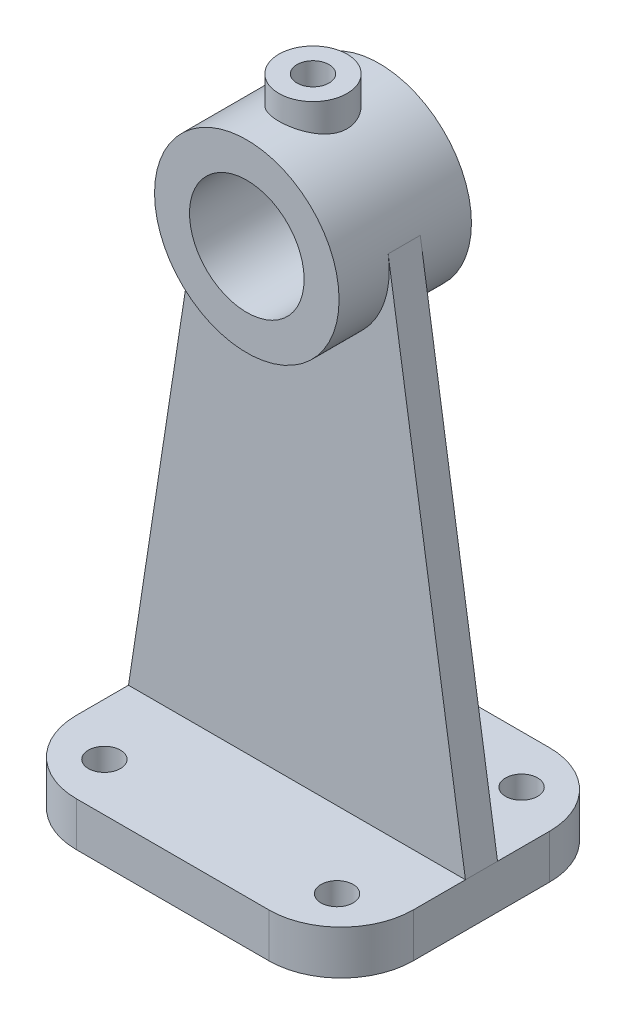
ISO-10303-21;
HEADER;
FILE_DESCRIPTION(('STEP AP214'),'2;1');
FILE_NAME('part.step','',(''),(''),'','','');
FILE_SCHEMA(('AUTOMOTIVE_DESIGN { 1 0 10303 214 1 1 1 1 }'));
ENDSEC;
DATA;
#1=APPLICATION_CONTEXT('core data for automotive mechanical design processes');
#2=APPLICATION_PROTOCOL_DEFINITION('international standard','automotive_design',2000,#1);
#3=PRODUCT_CONTEXT('',#1,'mechanical');
#4=PRODUCT('Part','Part','',(#3));
#5=PRODUCT_RELATED_PRODUCT_CATEGORY('part','',(#4));
#6=PRODUCT_DEFINITION_FORMATION('','',#4);
#7=PRODUCT_DEFINITION_CONTEXT('part definition',#1,'design');
#8=PRODUCT_DEFINITION('design','',#6,#7);
#9=PRODUCT_DEFINITION_SHAPE('','',#8);
#10=(LENGTH_UNIT() NAMED_UNIT(*) SI_UNIT(.MILLI.,.METRE.));
#11=(NAMED_UNIT(*) PLANE_ANGLE_UNIT() SI_UNIT($,.RADIAN.));
#12=(NAMED_UNIT(*) SI_UNIT($,.STERADIAN.) SOLID_ANGLE_UNIT());
#13=UNCERTAINTY_MEASURE_WITH_UNIT(LENGTH_MEASURE(1.E-05),#10,'distance_accuracy_value','');
#14=(GEOMETRIC_REPRESENTATION_CONTEXT(3) GLOBAL_UNCERTAINTY_ASSIGNED_CONTEXT((#13)) GLOBAL_UNIT_ASSIGNED_CONTEXT((#10,
#11,#12)) REPRESENTATION_CONTEXT('',''));
#15=CARTESIAN_POINT('',(0.,0.,0.));
#16=DIRECTION('',(0.,0.,1.));
#17=DIRECTION('',(1.,0.,0.));
#18=AXIS2_PLACEMENT_3D('',#15,#16,#17);
#19=CARTESIAN_POINT('',(0.,133.,-35.));
#20=DIRECTION('',(0.,0.,1.));
#21=DIRECTION('',(1.,0.,0.));
#22=AXIS2_PLACEMENT_3D('',#19,#20,#21);
#23=CYLINDRICAL_SURFACE('',#22,14.285);
#24=CARTESIAN_POINT('',(0.,133.,16.5));
#25=DIRECTION('',(0.,0.,1.));
#26=DIRECTION('',(1.,0.,0.));
#27=AXIS2_PLACEMENT_3D('',#24,#25,#26);
#28=CIRCLE('',#27,14.285);
#29=CARTESIAN_POINT('',(14.285,133.,16.5));
#30=VERTEX_POINT('',#29);
#31=EDGE_CURVE('E76',#30,#30,#28,.T.);
#32=ORIENTED_EDGE('',*,*,#31,.T.);
#33=EDGE_LOOP('',(#32));
#34=FACE_BOUND('',#33,.T.);
#35=CARTESIAN_POINT('',(0.,133.,-16.5));
#36=DIRECTION('',(0.,0.,1.));
#37=DIRECTION('',(1.,0.,0.));
#38=AXIS2_PLACEMENT_3D('',#35,#36,#37);
#39=CIRCLE('',#38,14.285);
#40=CARTESIAN_POINT('',(14.285,133.,-16.5));
#41=VERTEX_POINT('',#40);
#42=EDGE_CURVE('E80',#41,#41,#39,.T.);
#43=ORIENTED_EDGE('',*,*,#42,.F.);
#44=EDGE_LOOP('',(#43));
#45=FACE_BOUND('',#44,.T.);
#46=CARTESIAN_POINT('',(0.,147.285,4.));
#47=CARTESIAN_POINT('',(0.22009302424236,147.284997144267,3.99999568497697));
#48=CARTESIAN_POINT('',(0.44023091522861,147.279863933326,3.981773975814));
#49=CARTESIAN_POINT('',(0.874138155971838,147.259886135789,3.90951451057177));
#50=CARTESIAN_POINT('',(1.08790485893037,147.245037570332,3.85546208013016));
#51=CARTESIAN_POINT('',(1.50274577014489,147.207263379017,3.71345656078877));
#52=CARTESIAN_POINT('',(1.70383683851087,147.184348761203,3.62554965904913));
#53=CARTESIAN_POINT('',(2.08842353368351,147.132848509751,3.41850892059835));
#54=CARTESIAN_POINT('',(2.27191751756241,147.10426234736,3.29937217202442));
#55=CARTESIAN_POINT('',(2.62075210104795,147.043680766921,3.03006766107764));
#56=CARTESIAN_POINT('',(2.78558329002922,147.011622468074,2.87925420207317));
#57=CARTESIAN_POINT('',(3.08797591399402,146.94810217824,2.55225592676252));
#58=CARTESIAN_POINT('',(3.22553344326223,146.916640273241,2.37606748286802));
#59=CARTESIAN_POINT('',(3.47203324917597,146.857223487263,1.99916029211444));
#60=CARTESIAN_POINT('',(3.58037571791847,146.829347495564,1.79803567820712));
#61=CARTESIAN_POINT('',(3.76150125753448,146.78118930719,1.37951723065095));
#62=CARTESIAN_POINT('',(3.8342916400818,146.76090554929,1.16212675286877));
#63=CARTESIAN_POINT('',(3.94045126393201,146.730880008796,0.722920959308169));
#64=CARTESIAN_POINT('',(3.97475029240734,146.720890082871,0.501347773789032));
#65=CARTESIAN_POINT('',(4.00585428325889,146.711843113028,0.0553843124265916));
#66=CARTESIAN_POINT('',(4.00266703857357,146.71278379677,-0.169005368212922));
#67=CARTESIAN_POINT('',(3.9596240483907,146.725270500353,-0.606860128109716));
#68=CARTESIAN_POINT('',(3.92090839695286,146.736486761805,-0.820448206584452));
#69=CARTESIAN_POINT('',(3.80973978539547,146.767730710783,-1.23796834088705));
#70=CARTESIAN_POINT('',(3.73728388334307,146.787759166668,-1.44189955298969));
#71=CARTESIAN_POINT('',(3.55979761985351,146.834650244186,-1.83721751201345));
#72=CARTESIAN_POINT('',(3.45437928032734,146.861593540496,-2.02842009280114));
#73=CARTESIAN_POINT('',(3.21423078802663,146.919236896169,-2.39081510860438));
#74=CARTESIAN_POINT('',(3.07949433805684,146.949937761994,-2.56200323258076));
#75=CARTESIAN_POINT('',(2.77876950597874,147.012996110559,-2.88600607984723));
#76=CARTESIAN_POINT('',(2.61182794590744,147.045373372559,-3.03793361073108));
#77=CARTESIAN_POINT('',(2.25443645568894,147.107146421854,-3.31182786304264));
#78=CARTESIAN_POINT('',(2.06398540169295,147.136542066493,-3.43379315132012));
#79=CARTESIAN_POINT('',(1.6635152958382,147.189252522125,-3.64474764123881));
#80=CARTESIAN_POINT('',(1.45339976430188,147.21253496299,-3.73356231092955));
#81=CARTESIAN_POINT('',(1.02041583783739,147.250162316295,-3.87434386494985));
#82=CARTESIAN_POINT('',(0.797550539945529,147.264509389238,-3.92631965705661));
#83=CARTESIAN_POINT('',(0.352953421392332,147.282316899524,-3.9905226553432));
#84=CARTESIAN_POINT('',(0.131408509517547,147.286107168571,-4.00395452898717));
#85=CARTESIAN_POINT('',(-0.310773436458212,147.283329791694,-3.99403448235909));
#86=CARTESIAN_POINT('',(-0.531410571913228,147.276763335407,-3.97068678681072));
#87=CARTESIAN_POINT('',(-0.961118512194685,147.254224598873,-3.88885354567434));
#88=CARTESIAN_POINT('',(-1.17033014666336,147.238435618185,-3.83105232481679));
#89=CARTESIAN_POINT('',(-1.57605774326172,147.199255103343,-3.68275852997678));
#90=CARTESIAN_POINT('',(-1.77257226009566,147.175862705524,-3.59226224206014));
#91=CARTESIAN_POINT('',(-2.15191254185645,147.123312837239,-3.3789958757998));
#92=CARTESIAN_POINT('',(-2.33436331755546,147.094044428399,-3.25558683800589));
#93=CARTESIAN_POINT('',(-2.67638476686657,147.03311866464,-2.98079060753633));
#94=CARTESIAN_POINT('',(-2.83595043038472,147.001460788918,-2.82939730499466));
#95=CARTESIAN_POINT('',(-3.13283930298123,146.938089557771,-2.49728980038699));
#96=CARTESIAN_POINT('',(-3.26930925526994,146.906405525158,-2.31580571531386));
#97=CARTESIAN_POINT('',(-3.50989201018543,146.847645174096,-1.93183247587161));
#98=CARTESIAN_POINT('',(-3.61400602166742,146.820568683521,-1.72934410662381));
#99=CARTESIAN_POINT('',(-3.7861508530391,146.774405096014,-1.31001108760472));
#100=CARTESIAN_POINT('',(-3.85437964141863,146.755274290824,-1.0932527868899));
#101=CARTESIAN_POINT('',(-3.95322025246297,146.727198011851,-0.650703610337138));
#102=CARTESIAN_POINT('',(-3.98384291548367,146.718249602941,-0.424915356864122));
#103=CARTESIAN_POINT('',(-4.00593277353849,146.711813934234,0.0205009088167304));
#104=CARTESIAN_POINT('',(-3.99877852058209,146.713923140323,0.240055693915191));
#105=CARTESIAN_POINT('',(-3.94875140179654,146.728410363477,0.674694617937238));
#106=CARTESIAN_POINT('',(-3.90587964110076,146.740788062827,0.889778894971523));
#107=CARTESIAN_POINT('',(-3.78647041427012,146.774165178418,1.30743627144398));
#108=CARTESIAN_POINT('',(-3.71025329935655,146.795082429745,1.51010799700324));
#109=CARTESIAN_POINT('',(-3.52656461252407,146.843176678526,1.89994574406938));
#110=CARTESIAN_POINT('',(-3.41908769444223,146.870354746563,2.08710910623969));
#111=CARTESIAN_POINT('',(-3.17187183467299,146.929000745799,2.44712735039979));
#112=CARTESIAN_POINT('',(-3.0312058148959,146.960578598939,2.61932777652731));
#113=CARTESIAN_POINT('',(-2.72333111462037,147.023885031898,2.93812710254197));
#114=CARTESIAN_POINT('',(-2.55611583482905,147.055613647285,3.08471961804781));
#115=CARTESIAN_POINT('',(-2.1949851045199,147.116570452885,3.35166667884126));
#116=CARTESIAN_POINT('',(-2.00051922225587,147.145719069711,3.4712964394295));
#117=CARTESIAN_POINT('',(-1.59342113725689,147.197331098927,3.67598225645541));
#118=CARTESIAN_POINT('',(-1.38079948501504,147.219798360343,3.76105822917535));
#119=CARTESIAN_POINT('',(-0.974462444777233,147.252970806822,3.88444856822068));
#120=CARTESIAN_POINT('',(-0.782323841387655,147.264889806309,3.92767345910347));
#121=CARTESIAN_POINT('',(-0.393468401857418,147.280905201103,3.98544935071547));
#122=CARTESIAN_POINT('',(-0.196752128476115,147.285002552882,4.00000385741424));
#123=CARTESIAN_POINT('',(0.,147.285,4.));
#124=B_SPLINE_CURVE_WITH_KNOTS('',3,(#46,#47,#48,#49,#50,#51,#52,#53,#54,#55,#56,#57,#58,#59,
#60,#61,#62,#63,#64,#65,#66,#67,#68,#69,#70,#71,#72,#73,#74,#75,#76,#77,#78,#79,#80,#81,#82,#83,
#84,#85,#86,#87,#88,#89,#90,#91,#92,#93,#94,#95,#96,#97,#98,#99,#100,#101,#102,#103,#104,#105,
#106,#107,#108,#109,#110,#111,#112,#113,#114,#115,#116,#117,#118,#119,#120,#121,#122,#123),
.UNSPECIFIED.,.T.,.F.,(4,2,2,2,2,2,2,2,2,2,2,2,2,2,2,2,2,2,2,2,2,2,2,2,2,2,2,2,2,2,2,2,2,2,2,2,
2,2,4),(0.,0.65955708279654,1.31938445220335,1.97831479961346,2.6373066073844,3.31132655793415,
3.98544296168061,4.67249615256788,5.35940798392157,6.02934362721507,6.69914000153079,
7.34816709980077,7.99725079965864,8.65428185238697,9.3114541674288,9.9923679039777,
10.6733142035687,11.3577966188,12.0421134671274,12.7047962735527,13.3674029657744,
14.0172679140362,14.6672067056968,15.3308197515444,15.9945778569911,16.6791268921084,
17.3636503486099,18.0443567905301,18.7248669656606,19.3807195837233,20.0365519098412,
20.6862174060534,21.3359940757725,22.0066852800215,22.6775434583037,23.3647163707373,
24.0514926430534,24.6411757197952,25.2307866824254),.UNSPECIFIED.);
#125=CARTESIAN_POINT('',(0.,147.285,4.));
#126=VERTEX_POINT('',#125);
#127=EDGE_CURVE('E95',#126,#126,#124,.T.);
#128=ORIENTED_EDGE('',*,*,#127,.T.);
#129=EDGE_LOOP('',(#128));
#130=FACE_BOUND('',#129,.T.);
#131=ADVANCED_FACE('F54',(#34,#45,#130),#23,.F.);
#132=CARTESIAN_POINT('',(0.,133.,16.5));
#133=DIRECTION('',(0.,0.,-1.));
#134=DIRECTION('',(-1.,0.,0.));
#135=AXIS2_PLACEMENT_3D('',#132,#133,#134);
#136=CYLINDRICAL_SURFACE('',#135,23.);
#137=CARTESIAN_POINT('',(0.,133.,-16.5));
#138=DIRECTION('',(0.,0.,1.));
#139=DIRECTION('',(1.,0.,0.));
#140=AXIS2_PLACEMENT_3D('',#137,#138,#139);
#141=CIRCLE('',#140,23.);
#142=CARTESIAN_POINT('',(23.,133.,-16.5));
#143=VERTEX_POINT('',#142);
#144=EDGE_CURVE('E72',#143,#143,#141,.T.);
#145=ORIENTED_EDGE('',*,*,#144,.T.);
#146=EDGE_LOOP('',(#145));
#147=FACE_BOUND('',#146,.T.);
#148=CARTESIAN_POINT('',(0.,133.,16.5));
#149=DIRECTION('',(0.,0.,1.));
#150=DIRECTION('',(1.,0.,0.));
#151=AXIS2_PLACEMENT_3D('',#148,#149,#150);
#152=CIRCLE('',#151,23.);
#153=CARTESIAN_POINT('',(23.,133.,16.5));
#154=VERTEX_POINT('',#153);
#155=EDGE_CURVE('E70',#154,#154,#152,.T.);
#156=ORIENTED_EDGE('',*,*,#155,.F.);
#157=EDGE_LOOP('',(#156));
#158=FACE_BOUND('',#157,.T.);
#159=CARTESIAN_POINT('',(0.,156.,8.5));
#160=CARTESIAN_POINT('',(0.2303843535196,156.000000671532,8.50000092390018));
#161=CARTESIAN_POINT('',(0.460755764064527,155.996530952038,8.490626307051));
#162=CARTESIAN_POINT('',(0.919774466012311,155.982748471244,8.45322615583438));
#163=CARTESIAN_POINT('',(1.1484217809832,155.972435803656,8.42520087688676));
#164=CARTESIAN_POINT('',(1.6022698846208,155.945248103202,8.3507847979437));
#165=CARTESIAN_POINT('',(1.82747118348694,155.928374051743,8.30439674451403));
#166=CARTESIAN_POINT('',(2.27287192076185,155.888513516355,8.19369970409339));
#167=CARTESIAN_POINT('',(2.49307123986755,155.8655268868,8.12939029014135));
#168=CARTESIAN_POINT('',(2.92651312025245,155.814097734591,7.98358912358547));
#169=CARTESIAN_POINT('',(3.13976948976368,155.785666927461,7.90213423027139));
#170=CARTESIAN_POINT('',(3.55853700696215,155.724031929884,7.72261185035818));
#171=CARTESIAN_POINT('',(3.76404543129722,155.690826080425,7.62453858785046));
#172=CARTESIAN_POINT('',(4.16598405348069,155.620481916584,7.41256992322697));
#173=CARTESIAN_POINT('',(4.36241554655435,155.583344165766,7.29867678786405));
#174=CARTESIAN_POINT('',(4.74519086766156,155.506028256287,7.05581747048807));
#175=CARTESIAN_POINT('',(4.93153102121554,155.465849002747,6.92684585134791));
#176=CARTESIAN_POINT('',(5.29976389951742,155.381900682746,6.64962920289078));
#177=CARTESIAN_POINT('',(5.48123379841326,155.338053692788,6.50084593447948));
#178=CARTESIAN_POINT('',(5.83111960895947,155.249283751714,6.18893973695454));
#179=CARTESIAN_POINT('',(5.99953515207784,155.204360770269,6.02581640328981));
#180=CARTESIAN_POINT('',(6.32240937926896,155.114593222223,5.68612976194519));
#181=CARTESIAN_POINT('',(6.47686174274878,155.069748700055,5.50956043374837));
#182=CARTESIAN_POINT('',(6.77074060541012,154.981369696935,5.14412587806603));
#183=CARTESIAN_POINT('',(6.91017217460418,154.937834777547,4.95526483418476));
#184=CARTESIAN_POINT('',(7.17807302258331,154.851677371526,4.55900988476143));
#185=CARTESIAN_POINT('',(7.30594013632557,154.80914934851,4.35118761358472));
#186=CARTESIAN_POINT('',(7.54357291586669,154.728098636574,3.92479946494549));
#187=CARTESIAN_POINT('',(7.65334582675269,154.689574346817,3.70623793331072));
#188=CARTESIAN_POINT('',(7.85390827332818,154.61775840728,3.25975591370399));
#189=CARTESIAN_POINT('',(7.94469944390327,154.584466306918,3.03183623376825));
#190=CARTESIAN_POINT('',(8.10644014119538,154.524244158858,2.56824573177397));
#191=CARTESIAN_POINT('',(8.17739079401269,154.497313750099,2.33257535047556));
#192=CARTESIAN_POINT('',(8.29627782145823,154.45170543472,1.86484521566822));
#193=CARTESIAN_POINT('',(8.3450220077663,154.432740248809,1.63301877979533));
#194=CARTESIAN_POINT('',(8.4230304572334,154.402203623392,1.16562670174953));
#195=CARTESIAN_POINT('',(8.45229520778471,154.390631998893,0.930061153283447));
#196=CARTESIAN_POINT('',(8.49101286020158,154.375292657449,0.457134477937399));
#197=CARTESIAN_POINT('',(8.50047255224042,154.371522265853,0.219773994472154));
#198=CARTESIAN_POINT('',(8.49949116932001,154.371912709309,-0.25489472946103));
#199=CARTESIAN_POINT('',(8.48905083552335,154.376073248979,-0.492202971545446));
#200=CARTESIAN_POINT('',(8.44957598170591,154.391705799528,-0.951095500484753));
#201=CARTESIAN_POINT('',(8.42165766641654,154.4027387177,-1.17279190588333));
#202=CARTESIAN_POINT('',(8.34854088015422,154.431364993254,-1.61296485191828));
#203=CARTESIAN_POINT('',(8.30333637168613,154.448960642728,-1.83144023984012));
#204=CARTESIAN_POINT('',(8.1960856748943,154.490171534489,-2.26356551477596));
#205=CARTESIAN_POINT('',(8.13404403696607,154.513785150259,-2.47721668870552));
#206=CARTESIAN_POINT('',(7.99362727798094,154.566352012482,-2.89848958737727));
#207=CARTESIAN_POINT('',(7.91524591441696,154.595307299206,-3.10610897306538));
#208=CARTESIAN_POINT('',(7.74121894386533,154.658306546694,-3.51772106627672));
#209=CARTESIAN_POINT('',(7.64528542399561,154.692433436857,-3.72157925493569));
#210=CARTESIAN_POINT('',(7.4378293999481,154.764437679341,-4.12059182303324));
#211=CARTESIAN_POINT('',(7.32630159366143,154.802316305982,-4.31574321223744));
#212=CARTESIAN_POINT('',(7.08842127844987,154.880812754645,-4.69623573364903));
#213=CARTESIAN_POINT('',(6.96206718796178,154.9214308687,-4.88157581618987));
#214=CARTESIAN_POINT('',(6.69531756477428,155.004368403694,-5.24145938656223));
#215=CARTESIAN_POINT('',(6.55492141643844,155.046687899177,-5.41600240048174));
#216=CARTESIAN_POINT('',(6.25126853954555,155.134774253076,-5.76441405806297));
#217=CARTESIAN_POINT('',(6.08711740351488,155.180585644113,-5.93749297684727));
#218=CARTESIAN_POINT('',(5.7448379094331,155.271690264777,-6.26926062418038));
#219=CARTESIAN_POINT('',(5.5667138298831,155.316983648188,-6.42795372581741));
#220=CARTESIAN_POINT('',(5.19739902015437,155.405872639778,-6.73008087531602));
#221=CARTESIAN_POINT('',(5.006201488829,155.449467345462,-6.87350688011115));
#222=CARTESIAN_POINT('',(4.61204371215187,155.533744625961,-7.14395934113844));
#223=CARTESIAN_POINT('',(4.40908819828196,155.57442835764,-7.27099232850813));
#224=CARTESIAN_POINT('',(3.9894395609409,155.65238604974,-7.50956058640278));
#225=CARTESIAN_POINT('',(3.77258502758275,155.689599095028,-7.62083224605213));
#226=CARTESIAN_POINT('',(3.32951775467291,155.758834718336,-7.82455982031676));
#227=CARTESIAN_POINT('',(3.10330900114456,155.790859479154,-7.91702365191118));
#228=CARTESIAN_POINT('',(2.6430939746829,155.848803676122,-8.08231548600394));
#229=CARTESIAN_POINT('',(2.40908871632731,155.874723903155,-8.15514603230132));
#230=CARTESIAN_POINT('',(1.9350439952277,155.91969181521,-8.28044069240963));
#231=CARTESIAN_POINT('',(1.69500488285415,155.938739898297,-8.33290598588326));
#232=CARTESIAN_POINT('',(1.22339222806117,155.968591929582,-8.41472429982503));
#233=CARTESIAN_POINT('',(0.992025587660164,155.979772323411,-8.44513519679533));
#234=CARTESIAN_POINT('',(0.527345872452439,155.995128550509,-8.48683191770743));
#235=CARTESIAN_POINT('',(0.294032865288788,155.999304626191,-8.49811840352997));
#236=CARTESIAN_POINT('',(-0.17270385757152,156.000535365626,-8.50144862839866));
#237=CARTESIAN_POINT('',(-0.406127544111998,155.997591371527,-8.49349599405788));
#238=CARTESIAN_POINT('',(-0.871332852209467,155.984667108629,-8.45843884937208));
#239=CARTESIAN_POINT('',(-1.103114497456,155.974686941549,-8.43133461589561));
#240=CARTESIAN_POINT('',(-1.55467985982106,155.948468462395,-8.35962141314091));
#241=CARTESIAN_POINT('',(-1.77458834535143,155.9324778325,-8.31570410669215));
#242=CARTESIAN_POINT('',(-2.20985039311505,155.894634753244,-8.21076702133866));
#243=CARTESIAN_POINT('',(-2.42520232028864,155.87278023694,-8.14974121157023));
#244=CARTESIAN_POINT('',(-2.84981731667042,155.823764138454,-8.01114267003831));
#245=CARTESIAN_POINT('',(-3.05908208932274,155.796604057734,-7.93357461911824));
#246=CARTESIAN_POINT('',(-3.47038743547252,155.73762513017,-7.76247672300289));
#247=CARTESIAN_POINT('',(-3.67242523255576,155.705804516289,-7.66894082137123));
#248=CARTESIAN_POINT('',(-4.07370949866064,155.637303338465,-7.46372045551934));
#249=CARTESIAN_POINT('',(-4.27270977395785,155.600509574712,-7.35159246885837));
#250=CARTESIAN_POINT('',(-4.66066924727655,155.523704981047,-7.11197345631616));
#251=CARTESIAN_POINT('',(-4.84962496162319,155.483693046938,-6.98447714981418));
#252=CARTESIAN_POINT('',(-5.21640979180752,155.401437501487,-6.71497336271192));
#253=CARTESIAN_POINT('',(-5.39423733684981,155.359193576634,-6.57296384091647));
#254=CARTESIAN_POINT('',(-5.73778277441456,155.27350887622,-6.27530951555939));
#255=CARTESIAN_POINT('',(-5.9035002417258,155.230068058707,-6.11966423363803));
#256=CARTESIAN_POINT('',(-6.23093771015443,155.140592325504,-5.78645101222071));
#257=CARTESIAN_POINT('',(-6.39190143704776,155.09454966052,-5.60814103376892));
#258=CARTESIAN_POINT('',(-6.69824407978276,155.003614590936,-5.23842940821814));
#259=CARTESIAN_POINT('',(-6.84362800009919,154.95872182052,-5.04703199755984));
#260=CARTESIAN_POINT('',(-7.11796698893779,154.871334823052,-4.65213628498448));
#261=CARTESIAN_POINT('',(-7.24691401704295,154.828841775487,-4.44863213167027));
#262=CARTESIAN_POINT('',(-7.48729606917449,154.747562999759,-4.0309346702154));
#263=CARTESIAN_POINT('',(-7.59873845246631,154.708775716328,-3.81674590424817));
#264=CARTESIAN_POINT('',(-7.80363897624821,154.635967560877,-3.37816690182543));
#265=CARTESIAN_POINT('',(-7.89703007704826,154.601964579501,-3.15374232374013));
#266=CARTESIAN_POINT('',(-8.06442477725969,154.540033043942,-2.69706607766691));
#267=CARTESIAN_POINT('',(-8.13843694545878,154.512101805945,-2.46481792047954));
#268=CARTESIAN_POINT('',(-8.26635750384298,154.463271596412,-1.99418634976084));
#269=CARTESIAN_POINT('',(-8.32027137103585,154.442370709182,-1.75580462665109));
#270=CARTESIAN_POINT('',(-8.4074229052977,154.408349753906,-1.27474717112078));
#271=CARTESIAN_POINT('',(-8.44066195659651,154.395229164953,-1.03207172729447));
#272=CARTESIAN_POINT('',(-8.48465708275753,154.377818176352,-0.559722558904993));
#273=CARTESIAN_POINT('',(-8.49668974979592,154.373026653293,-0.330185357621207));
#274=CARTESIAN_POINT('',(-8.5021213985931,154.370866706402,0.129139238760008));
#275=CARTESIAN_POINT('',(-8.49552119285347,154.373497958894,0.358926622511256));
#276=CARTESIAN_POINT('',(-8.46376017847601,154.386094828791,0.816988071640291));
#277=CARTESIAN_POINT('',(-8.43860098219924,154.396059809058,1.04526226674214));
#278=CARTESIAN_POINT('',(-8.36998778541738,154.422993702746,1.49862130786705));
#279=CARTESIAN_POINT('',(-8.32653378534828,154.439962616001,1.7237061539661));
#280=CARTESIAN_POINT('',(-8.22328875520353,154.479769176185,2.16260543681577));
#281=CARTESIAN_POINT('',(-8.16400899290389,154.50242201407,2.37655732870775));
#282=CARTESIAN_POINT('',(-8.02911081461072,154.553156845182,2.79865966294023));
#283=CARTESIAN_POINT('',(-7.95348663757543,154.58124075237,3.00680803038589));
#284=CARTESIAN_POINT('',(-7.78652523737916,154.642040315485,3.41596599524497));
#285=CARTESIAN_POINT('',(-7.69519078284641,154.67475515512,3.61697684298877));
#286=CARTESIAN_POINT('',(-7.49746547993031,154.743941228821,4.01081416927355));
#287=CARTESIAN_POINT('',(-7.39106879451869,154.780413917659,4.20363743706633));
#288=CARTESIAN_POINT('',(-7.03874622358876,154.897931554853,4.78740158759602));
#289=CARTESIAN_POINT('',(-6.76813416106256,154.983852927251,5.16282190515085));
#290=CARTESIAN_POINT('',(-6.17010891150782,155.159117815245,5.8645017163819));
#291=CARTESIAN_POINT('',(-5.84267793904373,155.248462395528,6.1907457569867));
#292=CARTESIAN_POINT('',(-5.30564342666222,155.380497784868,6.64523375386263));
#293=CARTESIAN_POINT('',(-5.11365023571532,155.425249699654,6.79409136664982));
#294=CARTESIAN_POINT('',(-4.71723419092127,155.511969967823,7.07507268299527));
#295=CARTESIAN_POINT('',(-4.51281602105976,155.553939357844,7.20720263536728));
#296=CARTESIAN_POINT('',(-4.09272091384426,155.633943244485,7.45379099028934));
#297=CARTESIAN_POINT('',(-3.87703855030989,155.671975817862,7.56824076890878));
#298=CARTESIAN_POINT('',(-3.43602996644205,155.742988994294,7.77838846643826));
#299=CARTESIAN_POINT('',(-3.21070791624702,155.775971754187,7.87409439598308));
#300=CARTESIAN_POINT('',(-2.74469738963315,155.836890465011,8.0486317157481));
#301=CARTESIAN_POINT('',(-2.50374843283787,155.864634630443,8.12683632414537));
#302=CARTESIAN_POINT('',(-2.01513607400942,155.912867298053,8.26156453785463));
#303=CARTESIAN_POINT('',(-1.76747241618916,155.933355523407,8.3180873159818));
#304=CARTESIAN_POINT('',(-1.26765894148453,155.966404582231,8.4087766357977));
#305=CARTESIAN_POINT('',(-1.01551091297882,155.978968506138,8.44295189309979));
#306=CARTESIAN_POINT('',(-0.508903177123802,155.99576544291,8.48856196964795));
#307=CARTESIAN_POINT('',(-0.254443694845288,155.999999258339,8.49999897961571));
#308=CARTESIAN_POINT('',(0.,156.,8.5));
#309=B_SPLINE_CURVE_WITH_KNOTS('',3,(#159,#160,#161,#162,#163,#164,#165,#166,#167,#168,#169,
#170,#171,#172,#173,#174,#175,#176,#177,#178,#179,#180,#181,#182,#183,#184,#185,#186,#187,#188,
#189,#190,#191,#192,#193,#194,#195,#196,#197,#198,#199,#200,#201,#202,#203,#204,#205,#206,#207,
#208,#209,#210,#211,#212,#213,#214,#215,#216,#217,#218,#219,#220,#221,#222,#223,#224,#225,#226,
#227,#228,#229,#230,#231,#232,#233,#234,#235,#236,#237,#238,#239,#240,#241,#242,#243,#244,#245,
#246,#247,#248,#249,#250,#251,#252,#253,#254,#255,#256,#257,#258,#259,#260,#261,#262,#263,#264,
#265,#266,#267,#268,#269,#270,#271,#272,#273,#274,#275,#276,#277,#278,#279,#280,#281,#282,#283,
#284,#285,#286,#287,#288,#289,#290,#291,#292,#293,#294,#295,#296,#297,#298,#299,#300,#301,#302,
#303,#304,#305,#306,#307,#308),.UNSPECIFIED.,.T.,.F.,(4,2,2,2,2,2,2,2,2,2,2,2,2,2,2,2,2,2,2,2,2,
2,2,2,2,2,2,2,2,2,2,2,2,2,2,2,2,2,2,2,2,2,2,2,2,2,2,2,2,2,2,2,2,2,2,2,2,2,2,2,2,2,2,2,2,2,2,2,2,
2,2,2,2,2,4),(0.,0.69091503010114,1.38182059835294,2.07262286516762,2.76344159116241,
3.4527900944173,4.14237868209481,4.83186856369923,5.52160783868734,6.23698719904983,
6.95238674763541,7.66810852530132,8.38358796135488,9.1257307245763,9.86757560125284,
10.6093565569405,11.3510954023675,12.0631321065893,12.775150994369,13.4869257261475,
14.1986739488904,14.8690466022238,15.5396536087054,16.2100795573969,16.8807621097826,
17.5636355748394,18.2467417862765,18.9299209330141,19.6131300450521,20.3409940702333,
21.0686360876711,21.7966595663707,22.5243920920089,23.2631371078579,24.0015705094263,
24.7399081893688,25.4782030945197,26.178194260432,26.8781611997089,27.5779962040826,
28.2778210913718,28.9515057298538,29.6254281459989,30.2991601194086,30.9731482022817,
31.6664640970346,32.3600189008491,33.0536713835048,33.7473482101203,34.4802606726343,
35.2129370021746,35.9459703699519,36.6786947277413,37.4140901191451,38.1491597893407,
38.8840289982918,39.6188490006421,40.3076927836302,40.9965065294877,41.6852604398881,
42.374014333875,43.0427597039458,43.7117411773998,44.3806048765549,45.0497284919493,
46.4552838288507,47.8612799284531,48.6016035963852,49.3416498865246,50.0820560199662,
50.8221450292038,51.5855555541175,52.3489952010558,53.1121369259291,53.8752051221733),.UNSPECIFIED.);
#310=CARTESIAN_POINT('',(0.,156.,8.5));
#311=VERTEX_POINT('',#310);
#312=EDGE_CURVE('E12',#311,#311,#309,.T.);
#313=ORIENTED_EDGE('',*,*,#312,.F.);
#314=EDGE_LOOP('',(#313));
#315=FACE_BOUND('',#314,.T.);
#316=ADVANCED_FACE('F60',(#147,#158,#315),#136,.T.);
#317=CARTESIAN_POINT('',(0.,0.,16.5));
#318=DIRECTION('',(0.,0.,1.));
#319=DIRECTION('',(1.,0.,0.));
#320=AXIS2_PLACEMENT_3D('',#317,#318,#319);
#321=PLANE('',#320);
#322=ORIENTED_EDGE('',*,*,#31,.F.);
#323=EDGE_LOOP('',(#322));
#324=FACE_BOUND('',#323,.T.);
#325=ORIENTED_EDGE('',*,*,#155,.T.);
#326=EDGE_LOOP('',(#325));
#327=FACE_BOUND('',#326,.T.);
#328=ADVANCED_FACE('F119',(#324,#327),#321,.T.);
#329=CARTESIAN_POINT('',(0.,0.,-16.5));
#330=DIRECTION('',(0.,0.,1.));
#331=DIRECTION('',(1.,0.,0.));
#332=AXIS2_PLACEMENT_3D('',#329,#330,#331);
#333=PLANE('',#332);
#334=ORIENTED_EDGE('',*,*,#42,.T.);
#335=EDGE_LOOP('',(#334));
#336=FACE_BOUND('',#335,.T.);
#337=ORIENTED_EDGE('',*,*,#144,.F.);
#338=EDGE_LOOP('',(#337));
#339=FACE_BOUND('',#338,.T.);
#340=ADVANCED_FACE('F106',(#336,#339),#333,.F.);
#341=CARTESIAN_POINT('',(0.,162.,0.));
#342=DIRECTION('',(0.,-1.,0.));
#343=DIRECTION('',(0.,0.,-1.));
#344=AXIS2_PLACEMENT_3D('',#341,#342,#343);
#345=PLANE('',#344);
#346=CARTESIAN_POINT('',(0.,162.,0.));
#347=DIRECTION('',(0.,-1.,0.));
#348=DIRECTION('',(0.,0.,-1.));
#349=AXIS2_PLACEMENT_3D('',#346,#347,#348);
#350=CIRCLE('',#349,4.);
#351=CARTESIAN_POINT('',(0.,162.,-4.));
#352=VERTEX_POINT('',#351);
#353=EDGE_CURVE('E87',#352,#352,#350,.T.);
#354=ORIENTED_EDGE('',*,*,#353,.T.);
#355=EDGE_LOOP('',(#354));
#356=FACE_BOUND('',#355,.T.);
#357=CARTESIAN_POINT('',(0.,162.,0.));
#358=DIRECTION('',(0.,-1.,0.));
#359=DIRECTION('',(0.,0.,-1.));
#360=AXIS2_PLACEMENT_3D('',#357,#358,#359);
#361=CIRCLE('',#360,8.5);
#362=CARTESIAN_POINT('',(0.,162.,-8.5));
#363=VERTEX_POINT('',#362);
#364=EDGE_CURVE('E81',#363,#363,#361,.T.);
#365=ORIENTED_EDGE('',*,*,#364,.F.);
#366=EDGE_LOOP('',(#365));
#367=FACE_BOUND('',#366,.T.);
#368=ADVANCED_FACE('F103',(#356,#367),#345,.F.);
#369=CARTESIAN_POINT('',(0.,109.998,0.));
#370=DIRECTION('',(0.,1.,0.));
#371=DIRECTION('',(0.,0.,1.));
#372=AXIS2_PLACEMENT_3D('',#369,#370,#371);
#373=CYLINDRICAL_SURFACE('',#372,8.5);
#374=ORIENTED_EDGE('',*,*,#364,.T.);
#375=EDGE_LOOP('',(#374));
#376=FACE_BOUND('',#375,.T.);
#377=ORIENTED_EDGE('',*,*,#312,.T.);
#378=EDGE_LOOP('',(#377));
#379=FACE_BOUND('',#378,.T.);
#380=ADVANCED_FACE('F104',(#376,#379),#373,.T.);
#381=CARTESIAN_POINT('',(0.,109.998,0.));
#382=DIRECTION('',(0.,1.,0.));
#383=DIRECTION('',(0.,0.,1.));
#384=AXIS2_PLACEMENT_3D('',#381,#382,#383);
#385=CYLINDRICAL_SURFACE('',#384,4.);
#386=ORIENTED_EDGE('',*,*,#353,.F.);
#387=EDGE_LOOP('',(#386));
#388=FACE_BOUND('',#387,.T.);
#389=ORIENTED_EDGE('',*,*,#127,.F.);
#390=EDGE_LOOP('',(#389));
#391=FACE_BOUND('',#390,.T.);
#392=ADVANCED_FACE('F112',(#388,#391),#385,.F.);
#393=CLOSED_SHELL('',(#131,#316,#328,#340,#368,#380,#392));
#394=MANIFOLD_SOLID_BREP('B2',#393);
#395=CARTESIAN_POINT('',(0.,11.,0.));
#396=DIRECTION('',(0.,1.,0.));
#397=DIRECTION('',(0.,0.,1.));
#398=AXIS2_PLACEMENT_3D('',#395,#396,#397);
#399=PLANE('',#398);
#400=CARTESIAN_POINT('',(29.,11.,23.));
#401=DIRECTION('',(0.,1.,0.));
#402=DIRECTION('',(0.,0.,1.));
#403=AXIS2_PLACEMENT_3D('',#400,#401,#402);
#404=CIRCLE('',#403,4.00000000000001);
#405=CARTESIAN_POINT('',(29.,11.,27.));
#406=VERTEX_POINT('',#405);
#407=EDGE_CURVE('E315',#406,#406,#404,.T.);
#408=ORIENTED_EDGE('',*,*,#407,.F.);
#409=EDGE_LOOP('',(#408));
#410=FACE_BOUND('',#409,.T.);
#411=CARTESIAN_POINT('',(-29.,11.,23.));
#412=DIRECTION('',(0.,1.,0.));
#413=DIRECTION('',(0.,0.,-1.));
#414=AXIS2_PLACEMENT_3D('',#411,#412,#413);
#415=CIRCLE('',#414,4.00000000000001);
#416=CARTESIAN_POINT('',(-29.,11.,19.));
#417=VERTEX_POINT('',#416);
#418=EDGE_CURVE('E317',#417,#417,#415,.T.);
#419=ORIENTED_EDGE('',*,*,#418,.F.);
#420=EDGE_LOOP('',(#419));
#421=FACE_BOUND('',#420,.T.);
#422=DIRECTION('',(0.,0.,-1.));
#423=VECTOR('',#422,1.);
#424=CARTESIAN_POINT('',(42.,11.,-35.));
#425=LINE('',#424,#423);
#426=CARTESIAN_POINT('',(42.,11.,17.));
#427=VERTEX_POINT('',#426);
#428=CARTESIAN_POINT('',(42.,11.,4.));
#429=VERTEX_POINT('',#428);
#430=EDGE_CURVE('E336',#427,#429,#425,.T.);
#431=ORIENTED_EDGE('',*,*,#430,.T.);
#432=DIRECTION('',(-1.,0.,0.));
#433=VECTOR('',#432,1.);
#434=CARTESIAN_POINT('',(0.,11.,4.));
#435=LINE('',#434,#433);
#436=CARTESIAN_POINT('',(-42.,11.,4.));
#437=VERTEX_POINT('',#436);
#438=EDGE_CURVE('E298',#429,#437,#435,.T.);
#439=ORIENTED_EDGE('',*,*,#438,.T.);
#440=DIRECTION('',(0.,0.,1.));
#441=VECTOR('',#440,1.);
#442=CARTESIAN_POINT('',(-42.,11.,-35.));
#443=LINE('',#442,#441);
#444=CARTESIAN_POINT('',(-42.,11.,17.));
#445=VERTEX_POINT('',#444);
#446=EDGE_CURVE('E345',#437,#445,#443,.T.);
#447=ORIENTED_EDGE('',*,*,#446,.T.);
#448=CARTESIAN_POINT('',(-24.,11.,17.));
#449=DIRECTION('',(0.,1.,0.));
#450=DIRECTION('',(0.,0.,1.));
#451=AXIS2_PLACEMENT_3D('',#448,#449,#450);
#452=CIRCLE('',#451,18.);
#453=CARTESIAN_POINT('',(-24.,11.,35.));
#454=VERTEX_POINT('',#453);
#455=EDGE_CURVE('E385',#445,#454,#452,.T.);
#456=ORIENTED_EDGE('',*,*,#455,.T.);
#457=DIRECTION('',(1.,0.,0.));
#458=VECTOR('',#457,1.);
#459=CARTESIAN_POINT('',(-42.,11.,35.));
#460=LINE('',#459,#458);
#461=CARTESIAN_POINT('',(24.,11.,35.));
#462=VERTEX_POINT('',#461);
#463=EDGE_CURVE('E341',#454,#462,#460,.T.);
#464=ORIENTED_EDGE('',*,*,#463,.T.);
#465=CARTESIAN_POINT('',(24.,11.,17.));
#466=DIRECTION('',(0.,1.,0.));
#467=DIRECTION('',(0.,0.,1.));
#468=AXIS2_PLACEMENT_3D('',#465,#466,#467);
#469=CIRCLE('',#468,18.);
#470=EDGE_CURVE('E378',#462,#427,#469,.T.);
#471=ORIENTED_EDGE('',*,*,#470,.T.);
#472=EDGE_LOOP('',(#431,#439,#447,#456,#464,#471));
#473=FACE_BOUND('',#472,.T.);
#474=ADVANCED_FACE('F181',(#410,#421,#473),#399,.T.);
#475=CARTESIAN_POINT('',(42.,11.,-35.));
#476=DIRECTION('',(-1.,0.,0.));
#477=DIRECTION('',(0.,0.,1.));
#478=AXIS2_PLACEMENT_3D('',#475,#476,#477);
#479=PLANE('',#478);
#480=DIRECTION('',(0.,0.,-1.));
#481=VECTOR('',#480,1.);
#482=CARTESIAN_POINT('',(42.,0.,-35.));
#483=LINE('',#482,#481);
#484=CARTESIAN_POINT('',(42.,0.,17.));
#485=VERTEX_POINT('',#484);
#486=CARTESIAN_POINT('',(42.,0.,-17.));
#487=VERTEX_POINT('',#486);
#488=EDGE_CURVE('E334',#485,#487,#483,.T.);
#489=ORIENTED_EDGE('',*,*,#488,.T.);
#490=DIRECTION('',(0.,-1.,0.));
#491=VECTOR('',#490,1.);
#492=CARTESIAN_POINT('',(42.,11.,-17.));
#493=LINE('',#492,#491);
#494=CARTESIAN_POINT('',(42.,11.,-17.));
#495=VERTEX_POINT('',#494);
#496=EDGE_CURVE('E52',#487,#495,#493,.F.);
#497=ORIENTED_EDGE('',*,*,#496,.T.);
#498=CARTESIAN_POINT('',(42.,11.,-4.));
#499=VERTEX_POINT('',#498);
#500=EDGE_CURVE('E338',#499,#495,#425,.T.);
#501=ORIENTED_EDGE('',*,*,#500,.F.);
#502=DIRECTION('',(0.,0.,1.));
#503=VECTOR('',#502,1.);
#504=CARTESIAN_POINT('',(42.,11.,-4.));
#505=LINE('',#504,#503);
#506=EDGE_CURVE('E202',#499,#429,#505,.T.);
#507=ORIENTED_EDGE('',*,*,#506,.T.);
#508=ORIENTED_EDGE('',*,*,#430,.F.);
#509=DIRECTION('',(0.,-1.,0.));
#510=VECTOR('',#509,1.);
#511=CARTESIAN_POINT('',(42.,11.,17.));
#512=LINE('',#511,#510);
#513=EDGE_CURVE('E194',#427,#485,#512,.T.);
#514=ORIENTED_EDGE('',*,*,#513,.T.);
#515=EDGE_LOOP('',(#489,#497,#501,#507,#508,#514));
#516=FACE_BOUND('',#515,.T.);
#517=ADVANCED_FACE('F394',(#516),#479,.F.);
#518=CARTESIAN_POINT('',(-42.,11.,-35.));
#519=DIRECTION('',(0.,0.,1.));
#520=DIRECTION('',(1.,0.,0.));
#521=AXIS2_PLACEMENT_3D('',#518,#519,#520);
#522=PLANE('',#521);
#523=DIRECTION('',(-1.,0.,0.));
#524=VECTOR('',#523,1.);
#525=CARTESIAN_POINT('',(-42.,0.,-35.));
#526=LINE('',#525,#524);
#527=CARTESIAN_POINT('',(24.,0.,-35.));
#528=VERTEX_POINT('',#527);
#529=CARTESIAN_POINT('',(-24.,0.,-35.));
#530=VERTEX_POINT('',#529);
#531=EDGE_CURVE('E351',#528,#530,#526,.T.);
#532=ORIENTED_EDGE('',*,*,#531,.T.);
#533=DIRECTION('',(0.,-1.,0.));
#534=VECTOR('',#533,1.);
#535=CARTESIAN_POINT('',(-24.,11.,-35.));
#536=LINE('',#535,#534);
#537=CARTESIAN_POINT('',(-24.,11.,-35.));
#538=VERTEX_POINT('',#537);
#539=EDGE_CURVE('E376',#530,#538,#536,.F.);
#540=ORIENTED_EDGE('',*,*,#539,.T.);
#541=DIRECTION('',(-1.,0.,0.));
#542=VECTOR('',#541,1.);
#543=CARTESIAN_POINT('',(-42.,11.,-35.));
#544=LINE('',#543,#542);
#545=CARTESIAN_POINT('',(24.,11.,-35.));
#546=VERTEX_POINT('',#545);
#547=EDGE_CURVE('E339',#546,#538,#544,.T.);
#548=ORIENTED_EDGE('',*,*,#547,.F.);
#549=DIRECTION('',(0.,-1.,0.));
#550=VECTOR('',#549,1.);
#551=CARTESIAN_POINT('',(24.,11.,-35.));
#552=LINE('',#551,#550);
#553=EDGE_CURVE('E373',#546,#528,#552,.T.);
#554=ORIENTED_EDGE('',*,*,#553,.T.);
#555=EDGE_LOOP('',(#532,#540,#548,#554));
#556=FACE_BOUND('',#555,.T.);
#557=ADVANCED_FACE('F409',(#556),#522,.F.);
#558=CARTESIAN_POINT('',(-42.,11.,-35.));
#559=DIRECTION('',(1.,0.,0.));
#560=DIRECTION('',(0.,0.,-1.));
#561=AXIS2_PLACEMENT_3D('',#558,#559,#560);
#562=PLANE('',#561);
#563=CARTESIAN_POINT('',(-42.,11.,-17.));
#564=VERTEX_POINT('',#563);
#565=CARTESIAN_POINT('',(-42.,11.,-4.));
#566=VERTEX_POINT('',#565);
#567=EDGE_CURVE('E343',#564,#566,#443,.T.);
#568=ORIENTED_EDGE('',*,*,#567,.F.);
#569=DIRECTION('',(0.,-1.,0.));
#570=VECTOR('',#569,1.);
#571=CARTESIAN_POINT('',(-42.,11.,-17.));
#572=LINE('',#571,#570);
#573=CARTESIAN_POINT('',(-42.,0.,-17.));
#574=VERTEX_POINT('',#573);
#575=EDGE_CURVE('E362',#564,#574,#572,.T.);
#576=ORIENTED_EDGE('',*,*,#575,.T.);
#577=DIRECTION('',(0.,0.,1.));
#578=VECTOR('',#577,1.);
#579=CARTESIAN_POINT('',(-42.,0.,-35.));
#580=LINE('',#579,#578);
#581=CARTESIAN_POINT('',(-42.,0.,17.));
#582=VERTEX_POINT('',#581);
#583=EDGE_CURVE('E353',#574,#582,#580,.T.);
#584=ORIENTED_EDGE('',*,*,#583,.T.);
#585=DIRECTION('',(0.,-1.,0.));
#586=VECTOR('',#585,1.);
#587=CARTESIAN_POINT('',(-42.,11.,17.));
#588=LINE('',#587,#586);
#589=EDGE_CURVE('E346',#582,#445,#588,.F.);
#590=ORIENTED_EDGE('',*,*,#589,.T.);
#591=ORIENTED_EDGE('',*,*,#446,.F.);
#592=DIRECTION('',(0.,0.,1.));
#593=VECTOR('',#592,1.);
#594=CARTESIAN_POINT('',(-42.,11.,-4.));
#595=LINE('',#594,#593);
#596=EDGE_CURVE('E286',#566,#437,#595,.T.);
#597=ORIENTED_EDGE('',*,*,#596,.F.);
#598=EDGE_LOOP('',(#568,#576,#584,#590,#591,#597));
#599=FACE_BOUND('',#598,.T.);
#600=ADVANCED_FACE('F416',(#599),#562,.F.);
#601=CARTESIAN_POINT('',(-42.,11.,35.));
#602=DIRECTION('',(0.,0.,-1.));
#603=DIRECTION('',(-1.,0.,0.));
#604=AXIS2_PLACEMENT_3D('',#601,#602,#603);
#605=PLANE('',#604);
#606=ORIENTED_EDGE('',*,*,#463,.F.);
#607=DIRECTION('',(0.,-1.,0.));
#608=VECTOR('',#607,1.);
#609=CARTESIAN_POINT('',(-24.,11.,35.));
#610=LINE('',#609,#608);
#611=CARTESIAN_POINT('',(-24.,0.,35.));
#612=VERTEX_POINT('',#611);
#613=EDGE_CURVE('E389',#454,#612,#610,.T.);
#614=ORIENTED_EDGE('',*,*,#613,.T.);
#615=DIRECTION('',(1.,0.,0.));
#616=VECTOR('',#615,1.);
#617=CARTESIAN_POINT('',(-42.,0.,35.));
#618=LINE('',#617,#616);
#619=CARTESIAN_POINT('',(24.,0.,35.));
#620=VERTEX_POINT('',#619);
#621=EDGE_CURVE('E356',#612,#620,#618,.T.);
#622=ORIENTED_EDGE('',*,*,#621,.T.);
#623=DIRECTION('',(0.,-1.,0.));
#624=VECTOR('',#623,1.);
#625=CARTESIAN_POINT('',(24.,11.,35.));
#626=LINE('',#625,#624);
#627=EDGE_CURVE('E387',#620,#462,#626,.F.);
#628=ORIENTED_EDGE('',*,*,#627,.T.);
#629=EDGE_LOOP('',(#606,#614,#622,#628));
#630=FACE_BOUND('',#629,.T.);
#631=ADVANCED_FACE('F430',(#630),#605,.F.);
#632=DIRECTION('',(-1.,0.,0.));
#633=VECTOR('',#632,1.);
#634=CARTESIAN_POINT('',(0.,11.,-4.));
#635=LINE('',#634,#633);
#636=EDGE_CURVE('E196',#499,#566,#635,.T.);
#637=ORIENTED_EDGE('',*,*,#636,.F.);
#638=ORIENTED_EDGE('',*,*,#500,.T.);
#639=CARTESIAN_POINT('',(24.,11.,-17.));
#640=DIRECTION('',(0.,1.,0.));
#641=DIRECTION('',(0.,0.,1.));
#642=AXIS2_PLACEMENT_3D('',#639,#640,#641);
#643=CIRCLE('',#642,18.);
#644=EDGE_CURVE('E379',#495,#546,#643,.T.);
#645=ORIENTED_EDGE('',*,*,#644,.T.);
#646=ORIENTED_EDGE('',*,*,#547,.T.);
#647=CARTESIAN_POINT('',(-24.,11.,-17.));
#648=DIRECTION('',(0.,1.,0.));
#649=DIRECTION('',(0.,0.,1.));
#650=AXIS2_PLACEMENT_3D('',#647,#648,#649);
#651=CIRCLE('',#650,18.);
#652=EDGE_CURVE('E383',#538,#564,#651,.T.);
#653=ORIENTED_EDGE('',*,*,#652,.T.);
#654=ORIENTED_EDGE('',*,*,#567,.T.);
#655=EDGE_LOOP('',(#637,#638,#645,#646,#653,#654));
#656=FACE_BOUND('',#655,.T.);
#657=CARTESIAN_POINT('',(-29.,11.,-23.));
#658=DIRECTION('',(0.,1.,0.));
#659=DIRECTION('',(0.,0.,-1.));
#660=AXIS2_PLACEMENT_3D('',#657,#658,#659);
#661=CIRCLE('',#660,4.);
#662=CARTESIAN_POINT('',(-29.,11.,-27.));
#663=VERTEX_POINT('',#662);
#664=EDGE_CURVE('E324',#663,#663,#661,.T.);
#665=ORIENTED_EDGE('',*,*,#664,.F.);
#666=EDGE_LOOP('',(#665));
#667=FACE_BOUND('',#666,.T.);
#668=CARTESIAN_POINT('',(29.,11.,-23.));
#669=DIRECTION('',(0.,1.,0.));
#670=DIRECTION('',(0.,0.,1.));
#671=AXIS2_PLACEMENT_3D('',#668,#669,#670);
#672=CIRCLE('',#671,4.00000000000001);
#673=CARTESIAN_POINT('',(29.,11.,-19.));
#674=VERTEX_POINT('',#673);
#675=EDGE_CURVE('E312',#674,#674,#672,.T.);
#676=ORIENTED_EDGE('',*,*,#675,.F.);
#677=EDGE_LOOP('',(#676));
#678=FACE_BOUND('',#677,.T.);
#679=ADVANCED_FACE('F414',(#656,#667,#678),#399,.T.);
#680=CARTESIAN_POINT('',(0.,0.,0.));
#681=DIRECTION('',(0.,1.,0.));
#682=DIRECTION('',(0.,0.,1.));
#683=AXIS2_PLACEMENT_3D('',#680,#681,#682);
#684=PLANE('',#683);
#685=CARTESIAN_POINT('',(-29.,0.,-23.));
#686=DIRECTION('',(0.,1.,0.));
#687=DIRECTION('',(0.,0.,-1.));
#688=AXIS2_PLACEMENT_3D('',#685,#686,#687);
#689=CIRCLE('',#688,4.);
#690=CARTESIAN_POINT('',(-29.,0.,-27.));
#691=VERTEX_POINT('',#690);
#692=EDGE_CURVE('E310',#691,#691,#689,.T.);
#693=ORIENTED_EDGE('',*,*,#692,.T.);
#694=EDGE_LOOP('',(#693));
#695=FACE_BOUND('',#694,.T.);
#696=CARTESIAN_POINT('',(-29.,0.,23.));
#697=DIRECTION('',(0.,1.,0.));
#698=DIRECTION('',(0.,0.,-1.));
#699=AXIS2_PLACEMENT_3D('',#696,#697,#698);
#700=CIRCLE('',#699,4.00000000000001);
#701=CARTESIAN_POINT('',(-29.,0.,19.));
#702=VERTEX_POINT('',#701);
#703=EDGE_CURVE('E325',#702,#702,#700,.T.);
#704=ORIENTED_EDGE('',*,*,#703,.T.);
#705=EDGE_LOOP('',(#704));
#706=FACE_BOUND('',#705,.T.);
#707=CARTESIAN_POINT('',(29.,0.,23.));
#708=DIRECTION('',(0.,1.,0.));
#709=DIRECTION('',(0.,0.,1.));
#710=AXIS2_PLACEMENT_3D('',#707,#708,#709);
#711=CIRCLE('',#710,4.00000000000001);
#712=CARTESIAN_POINT('',(29.,0.,27.));
#713=VERTEX_POINT('',#712);
#714=EDGE_CURVE('E316',#713,#713,#711,.T.);
#715=ORIENTED_EDGE('',*,*,#714,.T.);
#716=EDGE_LOOP('',(#715));
#717=FACE_BOUND('',#716,.T.);
#718=CARTESIAN_POINT('',(29.,0.,-23.));
#719=DIRECTION('',(0.,1.,0.));
#720=DIRECTION('',(0.,0.,1.));
#721=AXIS2_PLACEMENT_3D('',#718,#719,#720);
#722=CIRCLE('',#721,4.00000000000001);
#723=CARTESIAN_POINT('',(29.,0.,-19.));
#724=VERTEX_POINT('',#723);
#725=EDGE_CURVE('E329',#724,#724,#722,.T.);
#726=ORIENTED_EDGE('',*,*,#725,.T.);
#727=EDGE_LOOP('',(#726));
#728=FACE_BOUND('',#727,.T.);
#729=ORIENTED_EDGE('',*,*,#583,.F.);
#730=CARTESIAN_POINT('',(-24.,0.,-17.));
#731=DIRECTION('',(0.,1.,0.));
#732=DIRECTION('',(0.,0.,1.));
#733=AXIS2_PLACEMENT_3D('',#730,#731,#732);
#734=CIRCLE('',#733,18.);
#735=EDGE_CURVE('E371',#574,#530,#734,.F.);
#736=ORIENTED_EDGE('',*,*,#735,.T.);
#737=ORIENTED_EDGE('',*,*,#531,.F.);
#738=CARTESIAN_POINT('',(24.,0.,-17.));
#739=DIRECTION('',(0.,1.,0.));
#740=DIRECTION('',(0.,0.,1.));
#741=AXIS2_PLACEMENT_3D('',#738,#739,#740);
#742=CIRCLE('',#741,18.);
#743=EDGE_CURVE('E370',#528,#487,#742,.F.);
#744=ORIENTED_EDGE('',*,*,#743,.T.);
#745=ORIENTED_EDGE('',*,*,#488,.F.);
#746=CARTESIAN_POINT('',(24.,0.,17.));
#747=DIRECTION('',(0.,1.,0.));
#748=DIRECTION('',(0.,0.,1.));
#749=AXIS2_PLACEMENT_3D('',#746,#747,#748);
#750=CIRCLE('',#749,18.);
#751=EDGE_CURVE('E364',#485,#620,#750,.F.);
#752=ORIENTED_EDGE('',*,*,#751,.T.);
#753=ORIENTED_EDGE('',*,*,#621,.F.);
#754=CARTESIAN_POINT('',(-24.,0.,17.));
#755=DIRECTION('',(0.,1.,0.));
#756=DIRECTION('',(0.,0.,1.));
#757=AXIS2_PLACEMENT_3D('',#754,#755,#756);
#758=CIRCLE('',#757,18.);
#759=EDGE_CURVE('E369',#612,#582,#758,.F.);
#760=ORIENTED_EDGE('',*,*,#759,.T.);
#761=EDGE_LOOP('',(#729,#736,#737,#744,#745,#752,#753,#760));
#762=FACE_BOUND('',#761,.T.);
#763=ADVANCED_FACE('F399',(#695,#706,#717,#728,#762),#684,.F.);
#764=CARTESIAN_POINT('',(29.,0.,-23.));
#765=DIRECTION('',(0.,1.,0.));
#766=DIRECTION('',(0.,0.,1.));
#767=AXIS2_PLACEMENT_3D('',#764,#765,#766);
#768=CYLINDRICAL_SURFACE('',#767,4.00000000000001);
#769=ORIENTED_EDGE('',*,*,#725,.F.);
#770=EDGE_LOOP('',(#769));
#771=FACE_BOUND('',#770,.T.);
#772=ORIENTED_EDGE('',*,*,#675,.T.);
#773=EDGE_LOOP('',(#772));
#774=FACE_BOUND('',#773,.T.);
#775=ADVANCED_FACE('F453',(#771,#774),#768,.F.);
#776=CARTESIAN_POINT('',(29.,0.,23.));
#777=DIRECTION('',(0.,1.,0.));
#778=DIRECTION('',(0.,0.,1.));
#779=AXIS2_PLACEMENT_3D('',#776,#777,#778);
#780=CYLINDRICAL_SURFACE('',#779,4.00000000000001);
#781=ORIENTED_EDGE('',*,*,#714,.F.);
#782=EDGE_LOOP('',(#781));
#783=FACE_BOUND('',#782,.T.);
#784=ORIENTED_EDGE('',*,*,#407,.T.);
#785=EDGE_LOOP('',(#784));
#786=FACE_BOUND('',#785,.T.);
#787=ADVANCED_FACE('F529',(#783,#786),#780,.F.);
#788=CARTESIAN_POINT('',(-29.,0.,23.));
#789=DIRECTION('',(0.,1.,0.));
#790=DIRECTION('',(0.,0.,1.));
#791=AXIS2_PLACEMENT_3D('',#788,#789,#790);
#792=CYLINDRICAL_SURFACE('',#791,4.00000000000001);
#793=ORIENTED_EDGE('',*,*,#703,.F.);
#794=EDGE_LOOP('',(#793));
#795=FACE_BOUND('',#794,.T.);
#796=ORIENTED_EDGE('',*,*,#418,.T.);
#797=EDGE_LOOP('',(#796));
#798=FACE_BOUND('',#797,.T.);
#799=ADVANCED_FACE('F531',(#795,#798),#792,.F.);
#800=CARTESIAN_POINT('',(-29.,0.,-23.));
#801=DIRECTION('',(0.,1.,0.));
#802=DIRECTION('',(0.,0.,1.));
#803=AXIS2_PLACEMENT_3D('',#800,#801,#802);
#804=CYLINDRICAL_SURFACE('',#803,4.);
#805=ORIENTED_EDGE('',*,*,#692,.F.);
#806=EDGE_LOOP('',(#805));
#807=FACE_BOUND('',#806,.T.);
#808=ORIENTED_EDGE('',*,*,#664,.T.);
#809=EDGE_LOOP('',(#808));
#810=FACE_BOUND('',#809,.T.);
#811=ADVANCED_FACE('F465',(#807,#810),#804,.F.);
#812=CARTESIAN_POINT('',(-24.,11.,-17.));
#813=DIRECTION('',(0.,-1.,0.));
#814=DIRECTION('',(0.,0.,-1.));
#815=AXIS2_PLACEMENT_3D('',#812,#813,#814);
#816=CYLINDRICAL_SURFACE('',#815,18.);
#817=ORIENTED_EDGE('',*,*,#652,.F.);
#818=ORIENTED_EDGE('',*,*,#539,.F.);
#819=ORIENTED_EDGE('',*,*,#735,.F.);
#820=ORIENTED_EDGE('',*,*,#575,.F.);
#821=EDGE_LOOP('',(#817,#818,#819,#820));
#822=FACE_BOUND('',#821,.T.);
#823=ADVANCED_FACE('F418',(#822),#816,.T.);
#824=CARTESIAN_POINT('',(-24.,11.,17.));
#825=DIRECTION('',(0.,-1.,0.));
#826=DIRECTION('',(0.,0.,-1.));
#827=AXIS2_PLACEMENT_3D('',#824,#825,#826);
#828=CYLINDRICAL_SURFACE('',#827,18.);
#829=ORIENTED_EDGE('',*,*,#455,.F.);
#830=ORIENTED_EDGE('',*,*,#589,.F.);
#831=ORIENTED_EDGE('',*,*,#759,.F.);
#832=ORIENTED_EDGE('',*,*,#613,.F.);
#833=EDGE_LOOP('',(#829,#830,#831,#832));
#834=FACE_BOUND('',#833,.T.);
#835=ADVANCED_FACE('F424',(#834),#828,.T.);
#836=CARTESIAN_POINT('',(24.,11.,-17.));
#837=DIRECTION('',(0.,-1.,0.));
#838=DIRECTION('',(0.,0.,-1.));
#839=AXIS2_PLACEMENT_3D('',#836,#837,#838);
#840=CYLINDRICAL_SURFACE('',#839,18.);
#841=ORIENTED_EDGE('',*,*,#644,.F.);
#842=ORIENTED_EDGE('',*,*,#496,.F.);
#843=ORIENTED_EDGE('',*,*,#743,.F.);
#844=ORIENTED_EDGE('',*,*,#553,.F.);
#845=EDGE_LOOP('',(#841,#842,#843,#844));
#846=FACE_BOUND('',#845,.T.);
#847=ADVANCED_FACE('F403',(#846),#840,.T.);
#848=CARTESIAN_POINT('',(24.,11.,17.));
#849=DIRECTION('',(0.,-1.,0.));
#850=DIRECTION('',(0.,0.,-1.));
#851=AXIS2_PLACEMENT_3D('',#848,#849,#850);
#852=CYLINDRICAL_SURFACE('',#851,18.);
#853=ORIENTED_EDGE('',*,*,#470,.F.);
#854=ORIENTED_EDGE('',*,*,#627,.F.);
#855=ORIENTED_EDGE('',*,*,#751,.F.);
#856=ORIENTED_EDGE('',*,*,#513,.F.);
#857=EDGE_LOOP('',(#853,#854,#855,#856));
#858=FACE_BOUND('',#857,.T.);
#859=ADVANCED_FACE('F183',(#858),#852,.T.);
#860=CARTESIAN_POINT('',(0.,133.,-4.));
#861=DIRECTION('',(0.,0.,1.));
#862=DIRECTION('',(1.,0.,0.));
#863=AXIS2_PLACEMENT_3D('',#860,#861,#862);
#864=CYLINDRICAL_SURFACE('',#863,23.);
#865=CARTESIAN_POINT('',(0.,133.,4.));
#866=DIRECTION('',(0.,0.,1.));
#867=DIRECTION('',(1.,0.,0.));
#868=AXIS2_PLACEMENT_3D('',#865,#866,#867);
#869=CIRCLE('',#868,23.);
#870=CARTESIAN_POINT('',(-22.7336322939982,136.490266855311,4.));
#871=VERTEX_POINT('',#870);
#872=CARTESIAN_POINT('',(22.7336322939982,136.490266855311,4.));
#873=VERTEX_POINT('',#872);
#874=EDGE_CURVE('E303',#871,#873,#869,.T.);
#875=ORIENTED_EDGE('',*,*,#874,.T.);
#876=DIRECTION('',(0.,0.,1.));
#877=VECTOR('',#876,1.);
#878=CARTESIAN_POINT('',(22.7336322939982,136.490266855311,-4.));
#879=LINE('',#878,#877);
#880=CARTESIAN_POINT('',(22.7336322939982,136.490266855311,-4.));
#881=VERTEX_POINT('',#880);
#882=EDGE_CURVE('E294',#881,#873,#879,.T.);
#883=ORIENTED_EDGE('',*,*,#882,.F.);
#884=CARTESIAN_POINT('',(0.,133.,-4.));
#885=DIRECTION('',(0.,0.,1.));
#886=DIRECTION('',(1.,0.,0.));
#887=AXIS2_PLACEMENT_3D('',#884,#885,#886);
#888=CIRCLE('',#887,23.);
#889=CARTESIAN_POINT('',(-22.7336322939982,136.490266855311,-4.));
#890=VERTEX_POINT('',#889);
#891=EDGE_CURVE('E280',#890,#881,#888,.T.);
#892=ORIENTED_EDGE('',*,*,#891,.F.);
#893=DIRECTION('',(0.,0.,1.));
#894=VECTOR('',#893,1.);
#895=CARTESIAN_POINT('',(-22.7336322939982,136.490266855311,-4.));
#896=LINE('',#895,#894);
#897=EDGE_CURVE('E284',#890,#871,#896,.T.);
#898=ORIENTED_EDGE('',*,*,#897,.T.);
#899=EDGE_LOOP('',(#875,#883,#892,#898));
#900=FACE_BOUND('',#899,.T.);
#901=ADVANCED_FACE('F291',(#900),#864,.F.);
#902=CARTESIAN_POINT('',(42.6827380755546,6.55302874931926,-4.));
#903=DIRECTION('',(0.988418795391227,0.151750732839602,0.));
#904=DIRECTION('',(-0.151750732839602,0.988418795391227,0.));
#905=AXIS2_PLACEMENT_3D('',#902,#903,#904);
#906=PLANE('',#905);
#907=DIRECTION('',(-0.151750732839602,0.988418795391227,0.));
#908=VECTOR('',#907,1.);
#909=CARTESIAN_POINT('',(42.6827380755546,6.55302874931926,4.));
#910=LINE('',#909,#908);
#911=EDGE_CURVE('E296',#429,#873,#910,.T.);
#912=ORIENTED_EDGE('',*,*,#911,.F.);
#913=ORIENTED_EDGE('',*,*,#506,.F.);
#914=DIRECTION('',(-0.151750732839602,0.988418795391227,0.));
#915=VECTOR('',#914,1.);
#916=CARTESIAN_POINT('',(42.6827380755546,6.55302874931926,-4.));
#917=LINE('',#916,#915);
#918=EDGE_CURVE('E292',#499,#881,#917,.T.);
#919=ORIENTED_EDGE('',*,*,#918,.T.);
#920=ORIENTED_EDGE('',*,*,#882,.T.);
#921=EDGE_LOOP('',(#912,#913,#919,#920));
#922=FACE_BOUND('',#921,.T.);
#923=ADVANCED_FACE('F436',(#922),#906,.T.);
#924=CARTESIAN_POINT('',(-42.6827380755547,6.55302874931927,-4.));
#925=DIRECTION('',(0.988418795391227,-0.151750732839603,0.));
#926=DIRECTION('',(0.151750732839603,0.988418795391227,0.));
#927=AXIS2_PLACEMENT_3D('',#924,#925,#926);
#928=PLANE('',#927);
#929=DIRECTION('',(0.151750732839603,0.988418795391227,0.));
#930=VECTOR('',#929,1.);
#931=CARTESIAN_POINT('',(-42.6827380755547,6.55302874931927,4.));
#932=LINE('',#931,#930);
#933=EDGE_CURVE('E287',#437,#871,#932,.T.);
#934=ORIENTED_EDGE('',*,*,#933,.T.);
#935=ORIENTED_EDGE('',*,*,#897,.F.);
#936=DIRECTION('',(0.151750732839603,0.988418795391227,0.));
#937=VECTOR('',#936,1.);
#938=CARTESIAN_POINT('',(-42.6827380755547,6.55302874931927,-4.));
#939=LINE('',#938,#937);
#940=EDGE_CURVE('E275',#566,#890,#939,.T.);
#941=ORIENTED_EDGE('',*,*,#940,.F.);
#942=ORIENTED_EDGE('',*,*,#596,.T.);
#943=EDGE_LOOP('',(#934,#935,#941,#942));
#944=FACE_BOUND('',#943,.T.);
#945=ADVANCED_FACE('F283',(#944),#928,.F.);
#946=CARTESIAN_POINT('',(0.,0.,-4.));
#947=DIRECTION('',(0.,0.,1.));
#948=DIRECTION('',(1.,0.,0.));
#949=AXIS2_PLACEMENT_3D('',#946,#947,#948);
#950=PLANE('',#949);
#951=ORIENTED_EDGE('',*,*,#891,.T.);
#952=ORIENTED_EDGE('',*,*,#918,.F.);
#953=ORIENTED_EDGE('',*,*,#636,.T.);
#954=ORIENTED_EDGE('',*,*,#940,.T.);
#955=EDGE_LOOP('',(#951,#952,#953,#954));
#956=FACE_BOUND('',#955,.T.);
#957=ADVANCED_FACE('F273',(#956),#950,.F.);
#958=CARTESIAN_POINT('',(0.,0.,4.));
#959=DIRECTION('',(0.,0.,1.));
#960=DIRECTION('',(1.,0.,0.));
#961=AXIS2_PLACEMENT_3D('',#958,#959,#960);
#962=PLANE('',#961);
#963=ORIENTED_EDGE('',*,*,#874,.F.);
#964=ORIENTED_EDGE('',*,*,#933,.F.);
#965=ORIENTED_EDGE('',*,*,#438,.F.);
#966=ORIENTED_EDGE('',*,*,#911,.T.);
#967=EDGE_LOOP('',(#963,#964,#965,#966));
#968=FACE_BOUND('',#967,.T.);
#969=ADVANCED_FACE('F517',(#968),#962,.T.);
#970=CLOSED_SHELL('',(#474,#517,#557,#600,#631,#679,#763,#775,#787,#799,#811,#823,#835,#847,
#859,#901,#923,#945,#957,#969));
#971=MANIFOLD_SOLID_BREP('B7',#970);
#972=ADVANCED_BREP_SHAPE_REPRESENTATION('',(#18,#394,#971),#14);
#973=SHAPE_DEFINITION_REPRESENTATION(#9,#972);
ENDSEC;
END-ISO-10303-21;
